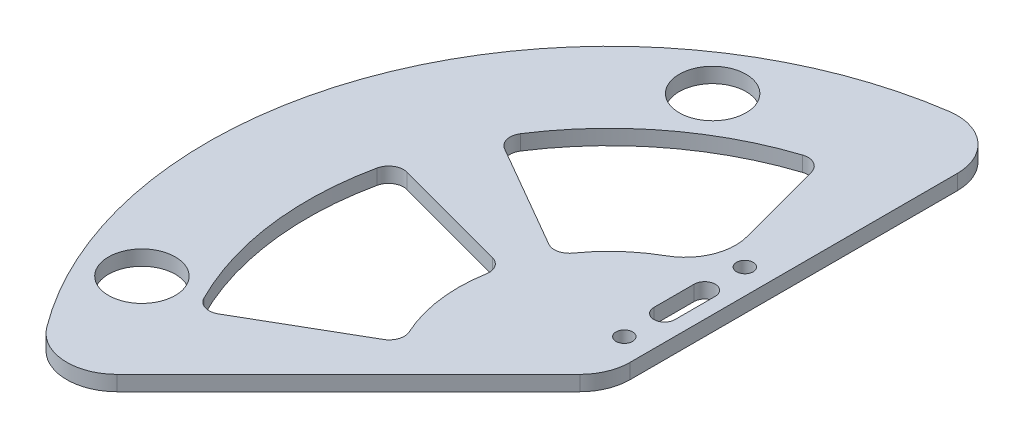
ISO-10303-21;
HEADER;
FILE_DESCRIPTION(('STEP AP214'),'2;1');
FILE_NAME('part.step','',(''),(''),'','','');
FILE_SCHEMA(('AUTOMOTIVE_DESIGN { 1 0 10303 214 1 1 1 1 }'));
ENDSEC;
DATA;
#1=APPLICATION_CONTEXT('core data for automotive mechanical design processes');
#2=APPLICATION_PROTOCOL_DEFINITION('international standard','automotive_design',2000,#1);
#3=PRODUCT_CONTEXT('',#1,'mechanical');
#4=PRODUCT('Part','Part','',(#3));
#5=PRODUCT_RELATED_PRODUCT_CATEGORY('part','',(#4));
#6=PRODUCT_DEFINITION_FORMATION('','',#4);
#7=PRODUCT_DEFINITION_CONTEXT('part definition',#1,'design');
#8=PRODUCT_DEFINITION('design','',#6,#7);
#9=PRODUCT_DEFINITION_SHAPE('','',#8);
#10=(LENGTH_UNIT() NAMED_UNIT(*) SI_UNIT(.MILLI.,.METRE.));
#11=(NAMED_UNIT(*) PLANE_ANGLE_UNIT() SI_UNIT($,.RADIAN.));
#12=(NAMED_UNIT(*) SI_UNIT($,.STERADIAN.) SOLID_ANGLE_UNIT());
#13=UNCERTAINTY_MEASURE_WITH_UNIT(LENGTH_MEASURE(1.E-05),#10,'distance_accuracy_value','');
#14=(GEOMETRIC_REPRESENTATION_CONTEXT(3) GLOBAL_UNCERTAINTY_ASSIGNED_CONTEXT((#13)) GLOBAL_UNIT_ASSIGNED_CONTEXT((#10,
#11,#12)) REPRESENTATION_CONTEXT('',''));
#15=CARTESIAN_POINT('',(0.,0.,0.));
#16=DIRECTION('',(0.,0.,1.));
#17=DIRECTION('',(1.,0.,0.));
#18=AXIS2_PLACEMENT_3D('',#15,#16,#17);
#19=CARTESIAN_POINT('',(0.,3.,0.));
#20=DIRECTION('',(0.,1.,0.));
#21=DIRECTION('',(0.,0.,1.));
#22=AXIS2_PLACEMENT_3D('',#19,#20,#21);
#23=PLANE('',#22);
#24=DIRECTION('',(0.,0.,1.));
#25=VECTOR('',#24,1.);
#26=CARTESIAN_POINT('',(-2.9,3.,-24.));
#27=LINE('',#26,#25);
#28=CARTESIAN_POINT('',(-2.90000000000001,3.,-16.));
#29=VERTEX_POINT('',#28);
#30=CARTESIAN_POINT('',(-2.90000000000001,3.,-24.));
#31=VERTEX_POINT('',#30);
#32=EDGE_CURVE('E241',#29,#31,#27,.F.);
#33=ORIENTED_EDGE('',*,*,#32,.F.);
#34=CARTESIAN_POINT('',(-5.00000000000001,3.,-16.));
#35=DIRECTION('',(0.,-1.,0.));
#36=DIRECTION('',(0.,0.,-1.));
#37=AXIS2_PLACEMENT_3D('',#34,#35,#36);
#38=CIRCLE('',#37,2.1);
#39=CARTESIAN_POINT('',(-7.1,3.,-16.));
#40=VERTEX_POINT('',#39);
#41=EDGE_CURVE('E240',#29,#40,#38,.T.);
#42=ORIENTED_EDGE('',*,*,#41,.T.);
#43=DIRECTION('',(0.,0.,-1.));
#44=VECTOR('',#43,1.);
#45=CARTESIAN_POINT('',(-7.10000000000001,3.,-24.));
#46=LINE('',#45,#44);
#47=CARTESIAN_POINT('',(-7.10000000000001,3.,-24.));
#48=VERTEX_POINT('',#47);
#49=EDGE_CURVE('E236',#48,#40,#46,.F.);
#50=ORIENTED_EDGE('',*,*,#49,.F.);
#51=CARTESIAN_POINT('',(-5.00000000000001,3.,-24.));
#52=DIRECTION('',(0.,-1.,0.));
#53=DIRECTION('',(0.,0.,-1.));
#54=AXIS2_PLACEMENT_3D('',#51,#52,#53);
#55=CIRCLE('',#54,2.1);
#56=EDGE_CURVE('E232',#48,#31,#55,.T.);
#57=ORIENTED_EDGE('',*,*,#56,.T.);
#58=EDGE_LOOP('',(#33,#42,#50,#57));
#59=FACE_BOUND('',#58,.T.);
#60=CARTESIAN_POINT('',(-63.4415450925655,3.,29.5832783218489));
#61=DIRECTION('',(0.,-1.,0.));
#62=DIRECTION('',(0.,0.,-1.));
#63=AXIS2_PLACEMENT_3D('',#60,#61,#62);
#64=CIRCLE('',#63,6.65000000000001);
#65=CARTESIAN_POINT('',(-63.4415450925655,3.,22.9332783218489));
#66=VERTEX_POINT('',#65);
#67=EDGE_CURVE('E269',#66,#66,#64,.T.);
#68=ORIENTED_EDGE('',*,*,#67,.T.);
#69=EDGE_LOOP('',(#68));
#70=FACE_BOUND('',#69,.T.);
#71=CARTESIAN_POINT('',(-5.00000000000001,3.,-8.));
#72=DIRECTION('',(0.,-1.,0.));
#73=DIRECTION('',(0.,0.,-1.));
#74=AXIS2_PLACEMENT_3D('',#71,#72,#73);
#75=CIRCLE('',#74,1.65);
#76=CARTESIAN_POINT('',(-5.00000000000001,3.,-9.65));
#77=VERTEX_POINT('',#76);
#78=EDGE_CURVE('E392',#77,#77,#75,.T.);
#79=ORIENTED_EDGE('',*,*,#78,.T.);
#80=EDGE_LOOP('',(#79));
#81=FACE_BOUND('',#80,.T.);
#82=CARTESIAN_POINT('',(0.,3.,0.));
#83=DIRECTION('',(0.,-1.,0.));
#84=DIRECTION('',(0.,0.,-1.));
#85=AXIS2_PLACEMENT_3D('',#82,#83,#84);
#86=CIRCLE('',#85,80.);
#87=CARTESIAN_POINT('',(-64.0695573343189,3.,47.9071166214836));
#88=VERTEX_POINT('',#87);
#89=CARTESIAN_POINT('',(-11.4285714285715,3.,-79.179465488863));
#90=VERTEX_POINT('',#89);
#91=EDGE_CURVE('E262',#88,#90,#86,.T.);
#92=ORIENTED_EDGE('',*,*,#91,.F.);
#93=CARTESIAN_POINT('',(-56.060862667529,3.,41.9187270437981));
#94=DIRECTION('',(0.,-1.,0.));
#95=DIRECTION('',(0.,0.,-1.));
#96=AXIS2_PLACEMENT_3D('',#93,#94,#95);
#97=CIRCLE('',#96,10.);
#98=CARTESIAN_POINT('',(-48.9897948556635,3.,48.9897948556636));
#99=VERTEX_POINT('',#98);
#100=EDGE_CURVE('E258',#99,#88,#97,.T.);
#101=ORIENTED_EDGE('',*,*,#100,.F.);
#102=DIRECTION('',(-0.707106781186547,0.,0.707106781186548));
#103=VECTOR('',#102,1.);
#104=CARTESIAN_POINT('',(0.,3.,0.));
#105=LINE('',#104,#103);
#106=CARTESIAN_POINT('',(-2.92893218813452,3.,2.92893218813451));
#107=VERTEX_POINT('',#106);
#108=EDGE_CURVE('E255',#99,#107,#105,.F.);
#109=ORIENTED_EDGE('',*,*,#108,.T.);
#110=CARTESIAN_POINT('',(-10.,3.,-4.14213562373096));
#111=DIRECTION('',(0.,-1.,0.));
#112=DIRECTION('',(0.,0.,-1.));
#113=AXIS2_PLACEMENT_3D('',#110,#111,#112);
#114=CIRCLE('',#113,10.);
#115=CARTESIAN_POINT('',(0.,3.,-4.14213562373096));
#116=VERTEX_POINT('',#115);
#117=EDGE_CURVE('E251',#116,#107,#114,.T.);
#118=ORIENTED_EDGE('',*,*,#117,.F.);
#119=DIRECTION('',(0.,0.,1.));
#120=VECTOR('',#119,1.);
#121=CARTESIAN_POINT('',(0.,3.,-80.));
#122=LINE('',#121,#120);
#123=CARTESIAN_POINT('',(0.,3.,-69.2820323027551));
#124=VERTEX_POINT('',#123);
#125=EDGE_CURVE('E245',#116,#124,#122,.F.);
#126=ORIENTED_EDGE('',*,*,#125,.T.);
#127=CARTESIAN_POINT('',(-10.,3.,-69.2820323027551));
#128=DIRECTION('',(0.,-1.,0.));
#129=DIRECTION('',(0.,0.,-1.));
#130=AXIS2_PLACEMENT_3D('',#127,#128,#129);
#131=CIRCLE('',#130,9.99999999999999);
#132=EDGE_CURVE('E387',#90,#124,#131,.T.);
#133=ORIENTED_EDGE('',*,*,#132,.F.);
#134=EDGE_LOOP('',(#92,#101,#109,#118,#126,#133));
#135=FACE_BOUND('',#134,.T.);
#136=CARTESIAN_POINT('',(-5.00000000000001,3.,-32.));
#137=DIRECTION('',(0.,-1.,0.));
#138=DIRECTION('',(0.,0.,-1.));
#139=AXIS2_PLACEMENT_3D('',#136,#137,#138);
#140=CIRCLE('',#139,1.65);
#141=CARTESIAN_POINT('',(-5.00000000000001,3.,-33.65));
#142=VERTEX_POINT('',#141);
#143=EDGE_CURVE('E389',#142,#142,#140,.T.);
#144=ORIENTED_EDGE('',*,*,#143,.T.);
#145=EDGE_LOOP('',(#144));
#146=FACE_BOUND('',#145,.T.);
#147=CARTESIAN_POINT('',(-38.1247324510516,3.,-58.7069397561799));
#148=DIRECTION('',(0.,-1.,0.));
#149=DIRECTION('',(0.,0.,-1.));
#150=AXIS2_PLACEMENT_3D('',#147,#148,#149);
#151=CIRCLE('',#150,6.65000000000001);
#152=CARTESIAN_POINT('',(-38.1247324510516,3.,-65.3569397561799));
#153=VERTEX_POINT('',#152);
#154=EDGE_CURVE('E395',#153,#153,#151,.T.);
#155=ORIENTED_EDGE('',*,*,#154,.T.);
#156=EDGE_LOOP('',(#155));
#157=FACE_BOUND('',#156,.T.);
#158=DIRECTION('',(0.866025403784442,0.,-0.499999999999995));
#159=VECTOR('',#158,1.);
#160=CARTESIAN_POINT('',(-51.9615242270665,3.,29.9999999999997));
#161=LINE('',#160,#159);
#162=CARTESIAN_POINT('',(-28.4604989415155,3.,16.4316767251548));
#163=VERTEX_POINT('',#162);
#164=CARTESIAN_POINT('',(-49.2950301754651,3.,28.4604989415151));
#165=VERTEX_POINT('',#164);
#166=EDGE_CURVE('E285',#163,#165,#161,.F.);
#167=ORIENTED_EDGE('',*,*,#166,.T.);
#168=CARTESIAN_POINT('',(-50.7950301754651,3.,25.8624227301618));
#169=DIRECTION('',(0.,1.,0.));
#170=DIRECTION('',(0.,0.,1.));
#171=AXIS2_PLACEMENT_3D('',#168,#169,#170);
#172=CIRCLE('',#171,3.);
#173=CARTESIAN_POINT('',(-53.4684528162791,3.,27.2236028738545));
#174=VERTEX_POINT('',#173);
#175=EDGE_CURVE('E202',#165,#174,#172,.F.);
#176=ORIENTED_EDGE('',*,*,#175,.T.);
#177=CARTESIAN_POINT('',(0.,3.,0.));
#178=DIRECTION('',(0.,1.,0.));
#179=DIRECTION('',(0.,0.,1.));
#180=AXIS2_PLACEMENT_3D('',#177,#178,#179);
#181=CIRCLE('',#180,60.);
#182=CARTESIAN_POINT('',(-58.6925463670236,3.,-12.4573271994752));
#183=VERTEX_POINT('',#182);
#184=EDGE_CURVE('E282',#174,#183,#181,.F.);
#185=ORIENTED_EDGE('',*,*,#184,.T.);
#186=CARTESIAN_POINT('',(-55.7579190486724,3.,-11.8344608395015));
#187=DIRECTION('',(0.,1.,0.));
#188=DIRECTION('',(0.,0.,1.));
#189=AXIS2_PLACEMENT_3D('',#186,#187,#188);
#190=CIRCLE('',#189,3.);
#191=CARTESIAN_POINT('',(-54.9814619133649,3.,-14.7322383183687));
#192=VERTEX_POINT('',#191);
#193=EDGE_CURVE('E278',#183,#192,#190,.F.);
#194=ORIENTED_EDGE('',*,*,#193,.T.);
#195=DIRECTION('',(-0.965925826289068,0.,-0.258819045102521));
#196=VECTOR('',#195,1.);
#197=CARTESIAN_POINT('',(-28.9777747886721,3.,-7.76457135307564));
#198=LINE('',#197,#196);
#199=CARTESIAN_POINT('',(-31.7435618361204,3.,-8.50566175887588));
#200=VERTEX_POINT('',#199);
#201=EDGE_CURVE('E274',#192,#200,#198,.F.);
#202=ORIENTED_EDGE('',*,*,#201,.T.);
#203=CARTESIAN_POINT('',(-32.5200189714279,3.,-5.60788428000867));
#204=DIRECTION('',(0.,1.,0.));
#205=DIRECTION('',(0.,0.,1.));
#206=AXIS2_PLACEMENT_3D('',#203,#204,#205);
#207=CIRCLE('',#206,3.);
#208=CARTESIAN_POINT('',(-29.563653610389,3.,-5.0980766181897));
#209=VERTEX_POINT('',#208);
#210=EDGE_CURVE('E273',#200,#209,#207,.F.);
#211=ORIENTED_EDGE('',*,*,#210,.T.);
#212=CARTESIAN_POINT('',(0.,3.,0.));
#213=DIRECTION('',(0.,1.,0.));
#214=DIRECTION('',(0.,0.,1.));
#215=AXIS2_PLACEMENT_3D('',#212,#213,#214);
#216=CIRCLE('',#215,30.);
#217=CARTESIAN_POINT('',(-27.2368172195595,3.,12.5760004670923));
#218=VERTEX_POINT('',#217);
#219=EDGE_CURVE('E266',#218,#209,#216,.F.);
#220=ORIENTED_EDGE('',*,*,#219,.F.);
#221=CARTESIAN_POINT('',(-29.9604989415155,3.,13.8336005138015));
#222=DIRECTION('',(0.,1.,0.));
#223=DIRECTION('',(0.,0.,1.));
#224=AXIS2_PLACEMENT_3D('',#221,#222,#223);
#225=CIRCLE('',#224,3.);
#226=EDGE_CURVE('E207',#218,#163,#225,.F.);
#227=ORIENTED_EDGE('',*,*,#226,.T.);
#228=EDGE_LOOP('',(#167,#176,#185,#194,#202,#211,#220,#227));
#229=FACE_BOUND('',#228,.T.);
#230=DIRECTION('',(-0.258819045102515,0.,-0.96592582628907));
#231=VECTOR('',#230,1.);
#232=CARTESIAN_POINT('',(-15.5291427061509,3.,-57.9555495773442));
#233=LINE('',#232,#231);
#234=CARTESIAN_POINT('',(-14.7322383183683,3.,-54.981461913365));
#235=VERTEX_POINT('',#234);
#236=CARTESIAN_POINT('',(-10.0240185136334,3.,-37.4101463888921));
#237=VERTEX_POINT('',#236);
#238=EDGE_CURVE('E313',#235,#237,#233,.F.);
#239=ORIENTED_EDGE('',*,*,#238,.T.);
#240=CARTESIAN_POINT('',(-19.6832767765241,3.,-34.8219559378669));
#241=DIRECTION('',(0.,1.,0.));
#242=DIRECTION('',(0.,0.,1.));
#243=AXIS2_PLACEMENT_3D('',#240,#241,#242);
#244=CIRCLE('',#243,10.);
#245=CARTESIAN_POINT('',(-14.7624575823931,3.,-26.1164669534002));
#246=VERTEX_POINT('',#245);
#247=EDGE_CURVE('E312',#237,#246,#244,.F.);
#248=ORIENTED_EDGE('',*,*,#247,.T.);
#249=CARTESIAN_POINT('',(0.,3.,0.));
#250=DIRECTION('',(0.,1.,0.));
#251=DIRECTION('',(0.,0.,1.));
#252=AXIS2_PLACEMENT_3D('',#249,#250,#251);
#253=CIRCLE('',#252,30.);
#254=CARTESIAN_POINT('',(-24.5095444922865,3.,-17.299775396826));
#255=VERTEX_POINT('',#254);
#256=EDGE_CURVE('E308',#255,#246,#253,.F.);
#257=ORIENTED_EDGE('',*,*,#256,.F.);
#258=CARTESIAN_POINT('',(-26.9604989415152,3.,-19.0297529365086));
#259=DIRECTION('',(0.,1.,0.));
#260=DIRECTION('',(0.,0.,1.));
#261=AXIS2_PLACEMENT_3D('',#258,#259,#260);
#262=CIRCLE('',#261,3.);
#263=CARTESIAN_POINT('',(-28.4604989415152,3.,-16.4316767251553));
#264=VERTEX_POINT('',#263);
#265=EDGE_CURVE('E302',#255,#264,#262,.F.);
#266=ORIENTED_EDGE('',*,*,#265,.T.);
#267=DIRECTION('',(0.866025403784433,0.,0.50000000000001));
#268=VECTOR('',#267,1.);
#269=CARTESIAN_POINT('',(-25.980762113533,3.,-15.0000000000003));
#270=LINE('',#269,#268);
#271=CARTESIAN_POINT('',(-49.2950301754646,3.,-28.460498941516));
#272=VERTEX_POINT('',#271);
#273=EDGE_CURVE('E298',#264,#272,#270,.F.);
#274=ORIENTED_EDGE('',*,*,#273,.T.);
#275=CARTESIAN_POINT('',(-47.7950301754646,3.,-31.0585751528693));
#276=DIRECTION('',(0.,1.,0.));
#277=DIRECTION('',(0.,0.,1.));
#278=AXIS2_PLACEMENT_3D('',#275,#276,#277);
#279=CIRCLE('',#278,3.);
#280=CARTESIAN_POINT('',(-50.3105580794364,3.,-32.6932370030203));
#281=VERTEX_POINT('',#280);
#282=EDGE_CURVE('E294',#272,#281,#279,.F.);
#283=ORIENTED_EDGE('',*,*,#282,.T.);
#284=CARTESIAN_POINT('',(0.,3.,0.));
#285=DIRECTION('',(0.,1.,0.));
#286=DIRECTION('',(0.,0.,1.));
#287=AXIS2_PLACEMENT_3D('',#284,#285,#286);
#288=CIRCLE('',#287,60.);
#289=CARTESIAN_POINT('',(-18.557911365511,3.,-57.0578997663762));
#290=VERTEX_POINT('',#289);
#291=EDGE_CURVE('E290',#281,#290,#288,.F.);
#292=ORIENTED_EDGE('',*,*,#291,.T.);
#293=CARTESIAN_POINT('',(-17.6300157972355,3.,-54.2050047780574));
#294=DIRECTION('',(0.,1.,0.));
#295=DIRECTION('',(0.,0.,1.));
#296=AXIS2_PLACEMENT_3D('',#293,#294,#295);
#297=CIRCLE('',#296,3.);
#298=EDGE_CURVE('E19',#290,#235,#297,.F.);
#299=ORIENTED_EDGE('',*,*,#298,.T.);
#300=EDGE_LOOP('',(#239,#248,#257,#266,#274,#283,#292,#299));
#301=FACE_BOUND('',#300,.T.);
#302=ADVANCED_FACE('F16',(#59,#70,#81,#135,#146,#157,#229,#301),#23,.T.);
#303=CARTESIAN_POINT('',(-17.6300157972355,0.,-54.2050047780574));
#304=DIRECTION('',(0.,1.,0.));
#305=DIRECTION('',(0.,0.,1.));
#306=AXIS2_PLACEMENT_3D('',#303,#304,#305);
#307=CYLINDRICAL_SURFACE('',#306,3.);
#308=DIRECTION('',(0.,1.,0.));
#309=VECTOR('',#308,1.);
#310=CARTESIAN_POINT('',(-14.7322383183683,0.,-54.981461913365));
#311=LINE('',#310,#309);
#312=CARTESIAN_POINT('',(-14.7322383183683,0.,-54.981461913365));
#313=VERTEX_POINT('',#312);
#314=EDGE_CURVE('E314',#313,#235,#311,.T.);
#315=ORIENTED_EDGE('',*,*,#314,.T.);
#316=ORIENTED_EDGE('',*,*,#298,.F.);
#317=DIRECTION('',(0.,1.,0.));
#318=VECTOR('',#317,1.);
#319=CARTESIAN_POINT('',(-18.557911365511,0.,-57.0578997663762));
#320=LINE('',#319,#318);
#321=CARTESIAN_POINT('',(-18.557911365511,0.,-57.0578997663762));
#322=VERTEX_POINT('',#321);
#323=EDGE_CURVE('E287',#290,#322,#320,.F.);
#324=ORIENTED_EDGE('',*,*,#323,.T.);
#325=CARTESIAN_POINT('',(-17.6300157972355,0.,-54.2050047780574));
#326=DIRECTION('',(0.,1.,0.));
#327=DIRECTION('',(0.,0.,1.));
#328=AXIS2_PLACEMENT_3D('',#325,#326,#327);
#329=CIRCLE('',#328,3.);
#330=EDGE_CURVE('E228',#322,#313,#329,.F.);
#331=ORIENTED_EDGE('',*,*,#330,.T.);
#332=EDGE_LOOP('',(#315,#316,#324,#331));
#333=FACE_BOUND('',#332,.T.);
#334=ADVANCED_FACE('F442',(#333),#307,.F.);
#335=CARTESIAN_POINT('',(-15.5291427061509,0.,-57.9555495773442));
#336=DIRECTION('',(0.96592582628907,0.,-0.258819045102515));
#337=DIRECTION('',(-0.258819045102515,0.,-0.96592582628907));
#338=AXIS2_PLACEMENT_3D('',#335,#336,#337);
#339=PLANE('',#338);
#340=ORIENTED_EDGE('',*,*,#314,.F.);
#341=DIRECTION('',(0.258819045102515,0.,0.96592582628907));
#342=VECTOR('',#341,1.);
#343=CARTESIAN_POINT('',(-14.7322383183683,0.,-54.981461913365));
#344=LINE('',#343,#342);
#345=CARTESIAN_POINT('',(-10.0240185136334,0.,-37.4101463888921));
#346=VERTEX_POINT('',#345);
#347=EDGE_CURVE('E224',#313,#346,#344,.T.);
#348=ORIENTED_EDGE('',*,*,#347,.T.);
#349=DIRECTION('',(0.,1.,0.));
#350=VECTOR('',#349,1.);
#351=CARTESIAN_POINT('',(-10.0240185136334,0.,-37.4101463888921));
#352=LINE('',#351,#350);
#353=EDGE_CURVE('E309',#346,#237,#352,.T.);
#354=ORIENTED_EDGE('',*,*,#353,.T.);
#355=ORIENTED_EDGE('',*,*,#238,.F.);
#356=EDGE_LOOP('',(#340,#348,#354,#355));
#357=FACE_BOUND('',#356,.T.);
#358=ADVANCED_FACE('F444',(#357),#339,.F.);
#359=CARTESIAN_POINT('',(-19.6832767765241,0.,-34.8219559378669));
#360=DIRECTION('',(0.,1.,0.));
#361=DIRECTION('',(0.,0.,1.));
#362=AXIS2_PLACEMENT_3D('',#359,#360,#361);
#363=CYLINDRICAL_SURFACE('',#362,10.);
#364=DIRECTION('',(0.,1.,0.));
#365=VECTOR('',#364,1.);
#366=CARTESIAN_POINT('',(-14.7624575823931,0.,-26.1164669534002));
#367=LINE('',#366,#365);
#368=CARTESIAN_POINT('',(-14.7624575823931,0.,-26.1164669534002));
#369=VERTEX_POINT('',#368);
#370=EDGE_CURVE('E306',#246,#369,#367,.F.);
#371=ORIENTED_EDGE('',*,*,#370,.F.);
#372=ORIENTED_EDGE('',*,*,#247,.F.);
#373=ORIENTED_EDGE('',*,*,#353,.F.);
#374=CARTESIAN_POINT('',(-19.6832767765241,0.,-34.8219559378669));
#375=DIRECTION('',(0.,1.,0.));
#376=DIRECTION('',(0.,0.,1.));
#377=AXIS2_PLACEMENT_3D('',#374,#375,#376);
#378=CIRCLE('',#377,10.);
#379=EDGE_CURVE('E227',#346,#369,#378,.F.);
#380=ORIENTED_EDGE('',*,*,#379,.T.);
#381=EDGE_LOOP('',(#371,#372,#373,#380));
#382=FACE_BOUND('',#381,.T.);
#383=ADVANCED_FACE('F418',(#382),#363,.F.);
#384=CARTESIAN_POINT('',(0.,0.,0.));
#385=DIRECTION('',(0.,1.,0.));
#386=DIRECTION('',(0.,0.,1.));
#387=AXIS2_PLACEMENT_3D('',#384,#385,#386);
#388=CYLINDRICAL_SURFACE('',#387,30.);
#389=ORIENTED_EDGE('',*,*,#256,.T.);
#390=ORIENTED_EDGE('',*,*,#370,.T.);
#391=CARTESIAN_POINT('',(0.,0.,0.));
#392=DIRECTION('',(0.,1.,0.));
#393=DIRECTION('',(0.,0.,1.));
#394=AXIS2_PLACEMENT_3D('',#391,#392,#393);
#395=CIRCLE('',#394,30.);
#396=CARTESIAN_POINT('',(-24.5095444922865,0.,-17.299775396826));
#397=VERTEX_POINT('',#396);
#398=EDGE_CURVE('E372',#369,#397,#395,.T.);
#399=ORIENTED_EDGE('',*,*,#398,.T.);
#400=DIRECTION('',(0.,1.,0.));
#401=VECTOR('',#400,1.);
#402=CARTESIAN_POINT('',(-24.5095444922865,0.,-17.299775396826));
#403=LINE('',#402,#401);
#404=EDGE_CURVE('E303',#397,#255,#403,.T.);
#405=ORIENTED_EDGE('',*,*,#404,.T.);
#406=EDGE_LOOP('',(#389,#390,#399,#405));
#407=FACE_BOUND('',#406,.T.);
#408=ADVANCED_FACE('F422',(#407),#388,.T.);
#409=CARTESIAN_POINT('',(-26.9604989415152,0.,-19.0297529365086));
#410=DIRECTION('',(0.,1.,0.));
#411=DIRECTION('',(0.,0.,1.));
#412=AXIS2_PLACEMENT_3D('',#409,#410,#411);
#413=CYLINDRICAL_SURFACE('',#412,3.);
#414=CARTESIAN_POINT('',(-26.9604989415152,0.,-19.0297529365086));
#415=DIRECTION('',(0.,1.,0.));
#416=DIRECTION('',(0.,0.,1.));
#417=AXIS2_PLACEMENT_3D('',#414,#415,#416);
#418=CIRCLE('',#417,3.);
#419=CARTESIAN_POINT('',(-28.4604989415152,0.,-16.4316767251553));
#420=VERTEX_POINT('',#419);
#421=EDGE_CURVE('E223',#397,#420,#418,.F.);
#422=ORIENTED_EDGE('',*,*,#421,.T.);
#423=DIRECTION('',(0.,1.,0.));
#424=VECTOR('',#423,1.);
#425=CARTESIAN_POINT('',(-28.4604989415152,0.,-16.4316767251553));
#426=LINE('',#425,#424);
#427=EDGE_CURVE('E299',#420,#264,#426,.T.);
#428=ORIENTED_EDGE('',*,*,#427,.T.);
#429=ORIENTED_EDGE('',*,*,#265,.F.);
#430=ORIENTED_EDGE('',*,*,#404,.F.);
#431=EDGE_LOOP('',(#422,#428,#429,#430));
#432=FACE_BOUND('',#431,.T.);
#433=ADVANCED_FACE('F429',(#432),#413,.F.);
#434=CARTESIAN_POINT('',(-25.980762113533,0.,-15.0000000000003));
#435=DIRECTION('',(-0.50000000000001,0.,0.866025403784433));
#436=DIRECTION('',(0.866025403784433,0.,0.50000000000001));
#437=AXIS2_PLACEMENT_3D('',#434,#435,#436);
#438=PLANE('',#437);
#439=ORIENTED_EDGE('',*,*,#427,.F.);
#440=DIRECTION('',(-0.866025403784433,0.,-0.50000000000001));
#441=VECTOR('',#440,1.);
#442=CARTESIAN_POINT('',(-28.4604989415152,0.,-16.4316767251553));
#443=LINE('',#442,#441);
#444=CARTESIAN_POINT('',(-49.2950301754646,0.,-28.460498941516));
#445=VERTEX_POINT('',#444);
#446=EDGE_CURVE('E219',#420,#445,#443,.T.);
#447=ORIENTED_EDGE('',*,*,#446,.T.);
#448=DIRECTION('',(0.,1.,0.));
#449=VECTOR('',#448,1.);
#450=CARTESIAN_POINT('',(-49.2950301754646,0.,-28.460498941516));
#451=LINE('',#450,#449);
#452=EDGE_CURVE('E295',#445,#272,#451,.T.);
#453=ORIENTED_EDGE('',*,*,#452,.T.);
#454=ORIENTED_EDGE('',*,*,#273,.F.);
#455=EDGE_LOOP('',(#439,#447,#453,#454));
#456=FACE_BOUND('',#455,.T.);
#457=ADVANCED_FACE('F432',(#456),#438,.F.);
#458=CARTESIAN_POINT('',(-47.7950301754646,0.,-31.0585751528693));
#459=DIRECTION('',(0.,1.,0.));
#460=DIRECTION('',(0.,0.,1.));
#461=AXIS2_PLACEMENT_3D('',#458,#459,#460);
#462=CYLINDRICAL_SURFACE('',#461,3.);
#463=DIRECTION('',(0.,1.,0.));
#464=VECTOR('',#463,1.);
#465=CARTESIAN_POINT('',(-50.3105580794364,0.,-32.6932370030204));
#466=LINE('',#465,#464);
#467=CARTESIAN_POINT('',(-50.3105580794364,0.,-32.6932370030203));
#468=VERTEX_POINT('',#467);
#469=EDGE_CURVE('E291',#468,#281,#466,.T.);
#470=ORIENTED_EDGE('',*,*,#469,.T.);
#471=ORIENTED_EDGE('',*,*,#282,.F.);
#472=ORIENTED_EDGE('',*,*,#452,.F.);
#473=CARTESIAN_POINT('',(-47.7950301754646,0.,-31.0585751528693));
#474=DIRECTION('',(0.,1.,0.));
#475=DIRECTION('',(0.,0.,1.));
#476=AXIS2_PLACEMENT_3D('',#473,#474,#475);
#477=CIRCLE('',#476,3.);
#478=EDGE_CURVE('E222',#445,#468,#477,.F.);
#479=ORIENTED_EDGE('',*,*,#478,.T.);
#480=EDGE_LOOP('',(#470,#471,#472,#479));
#481=FACE_BOUND('',#480,.T.);
#482=ADVANCED_FACE('F436',(#481),#462,.F.);
#483=CARTESIAN_POINT('',(0.,0.,0.));
#484=DIRECTION('',(0.,1.,0.));
#485=DIRECTION('',(0.,0.,1.));
#486=AXIS2_PLACEMENT_3D('',#483,#484,#485);
#487=CYLINDRICAL_SURFACE('',#486,60.);
#488=ORIENTED_EDGE('',*,*,#323,.F.);
#489=ORIENTED_EDGE('',*,*,#291,.F.);
#490=ORIENTED_EDGE('',*,*,#469,.F.);
#491=CARTESIAN_POINT('',(0.,0.,0.));
#492=DIRECTION('',(0.,1.,0.));
#493=DIRECTION('',(0.,0.,1.));
#494=AXIS2_PLACEMENT_3D('',#491,#492,#493);
#495=CIRCLE('',#494,60.);
#496=EDGE_CURVE('E213',#468,#322,#495,.F.);
#497=ORIENTED_EDGE('',*,*,#496,.T.);
#498=EDGE_LOOP('',(#488,#489,#490,#497));
#499=FACE_BOUND('',#498,.T.);
#500=ADVANCED_FACE('F440',(#499),#487,.F.);
#501=CARTESIAN_POINT('',(-29.9604989415155,0.,13.8336005138015));
#502=DIRECTION('',(0.,1.,0.));
#503=DIRECTION('',(0.,0.,1.));
#504=AXIS2_PLACEMENT_3D('',#501,#502,#503);
#505=CYLINDRICAL_SURFACE('',#504,3.);
#506=DIRECTION('',(0.,1.,0.));
#507=VECTOR('',#506,1.);
#508=CARTESIAN_POINT('',(-28.4604989415155,0.,16.4316767251548));
#509=LINE('',#508,#507);
#510=CARTESIAN_POINT('',(-28.4604989415155,0.,16.4316767251548));
#511=VERTEX_POINT('',#510);
#512=EDGE_CURVE('E206',#511,#163,#509,.T.);
#513=ORIENTED_EDGE('',*,*,#512,.T.);
#514=ORIENTED_EDGE('',*,*,#226,.F.);
#515=DIRECTION('',(0.,1.,0.));
#516=VECTOR('',#515,1.);
#517=CARTESIAN_POINT('',(-27.2368172195596,0.,12.5760004670922));
#518=LINE('',#517,#516);
#519=CARTESIAN_POINT('',(-27.2368172195595,0.,12.5760004670923));
#520=VERTEX_POINT('',#519);
#521=EDGE_CURVE('E265',#520,#218,#518,.T.);
#522=ORIENTED_EDGE('',*,*,#521,.F.);
#523=CARTESIAN_POINT('',(-29.9604989415155,0.,13.8336005138015));
#524=DIRECTION('',(0.,1.,0.));
#525=DIRECTION('',(0.,0.,1.));
#526=AXIS2_PLACEMENT_3D('',#523,#524,#525);
#527=CIRCLE('',#526,3.);
#528=EDGE_CURVE('E211',#520,#511,#527,.F.);
#529=ORIENTED_EDGE('',*,*,#528,.T.);
#530=EDGE_LOOP('',(#513,#514,#522,#529));
#531=FACE_BOUND('',#530,.T.);
#532=ADVANCED_FACE('F539',(#531),#505,.F.);
#533=CARTESIAN_POINT('',(-51.9615242270665,0.,29.9999999999997));
#534=DIRECTION('',(0.499999999999995,0.,0.866025403784442));
#535=DIRECTION('',(0.866025403784442,0.,-0.499999999999995));
#536=AXIS2_PLACEMENT_3D('',#533,#534,#535);
#537=PLANE('',#536);
#538=ORIENTED_EDGE('',*,*,#512,.F.);
#539=DIRECTION('',(-0.866025403784442,0.,0.499999999999995));
#540=VECTOR('',#539,1.);
#541=CARTESIAN_POINT('',(-28.4604989415155,0.,16.4316767251548));
#542=LINE('',#541,#540);
#543=CARTESIAN_POINT('',(-49.2950301754651,0.,28.4604989415151));
#544=VERTEX_POINT('',#543);
#545=EDGE_CURVE('E191',#511,#544,#542,.T.);
#546=ORIENTED_EDGE('',*,*,#545,.T.);
#547=DIRECTION('',(0.,1.,0.));
#548=VECTOR('',#547,1.);
#549=CARTESIAN_POINT('',(-49.2950301754651,0.,28.4604989415151));
#550=LINE('',#549,#548);
#551=EDGE_CURVE('E200',#165,#544,#550,.F.);
#552=ORIENTED_EDGE('',*,*,#551,.F.);
#553=ORIENTED_EDGE('',*,*,#166,.F.);
#554=EDGE_LOOP('',(#538,#546,#552,#553));
#555=FACE_BOUND('',#554,.T.);
#556=ADVANCED_FACE('F209',(#555),#537,.F.);
#557=CARTESIAN_POINT('',(-50.7950301754651,0.,25.8624227301618));
#558=DIRECTION('',(0.,1.,0.));
#559=DIRECTION('',(0.,0.,1.));
#560=AXIS2_PLACEMENT_3D('',#557,#558,#559);
#561=CYLINDRICAL_SURFACE('',#560,3.);
#562=CARTESIAN_POINT('',(-50.7950301754651,0.,25.8624227301618));
#563=DIRECTION('',(0.,1.,0.));
#564=DIRECTION('',(0.,0.,1.));
#565=AXIS2_PLACEMENT_3D('',#562,#563,#564);
#566=CIRCLE('',#565,3.);
#567=CARTESIAN_POINT('',(-53.4684528162791,0.,27.2236028738545));
#568=VERTEX_POINT('',#567);
#569=EDGE_CURVE('E185',#544,#568,#566,.F.);
#570=ORIENTED_EDGE('',*,*,#569,.T.);
#571=DIRECTION('',(0.,1.,0.));
#572=VECTOR('',#571,1.);
#573=CARTESIAN_POINT('',(-53.4684528162791,0.,27.2236028738545));
#574=LINE('',#573,#572);
#575=EDGE_CURVE('E283',#568,#174,#574,.T.);
#576=ORIENTED_EDGE('',*,*,#575,.T.);
#577=ORIENTED_EDGE('',*,*,#175,.F.);
#578=ORIENTED_EDGE('',*,*,#551,.T.);
#579=EDGE_LOOP('',(#570,#576,#577,#578));
#580=FACE_BOUND('',#579,.T.);
#581=ADVANCED_FACE('F201',(#580),#561,.F.);
#582=CARTESIAN_POINT('',(0.,0.,0.));
#583=DIRECTION('',(0.,1.,0.));
#584=DIRECTION('',(0.,0.,1.));
#585=AXIS2_PLACEMENT_3D('',#582,#583,#584);
#586=CYLINDRICAL_SURFACE('',#585,60.);
#587=DIRECTION('',(0.,1.,0.));
#588=VECTOR('',#587,1.);
#589=CARTESIAN_POINT('',(-58.6925463670236,0.,-12.4573271994752));
#590=LINE('',#589,#588);
#591=CARTESIAN_POINT('',(-58.6925463670236,0.,-12.4573271994752));
#592=VERTEX_POINT('',#591);
#593=EDGE_CURVE('E279',#592,#183,#590,.T.);
#594=ORIENTED_EDGE('',*,*,#593,.T.);
#595=ORIENTED_EDGE('',*,*,#184,.F.);
#596=ORIENTED_EDGE('',*,*,#575,.F.);
#597=CARTESIAN_POINT('',(0.,0.,0.));
#598=DIRECTION('',(0.,1.,0.));
#599=DIRECTION('',(0.,0.,1.));
#600=AXIS2_PLACEMENT_3D('',#597,#598,#599);
#601=CIRCLE('',#600,60.);
#602=EDGE_CURVE('E195',#568,#592,#601,.F.);
#603=ORIENTED_EDGE('',*,*,#602,.T.);
#604=EDGE_LOOP('',(#594,#595,#596,#603));
#605=FACE_BOUND('',#604,.T.);
#606=ADVANCED_FACE('F530',(#605),#586,.F.);
#607=CARTESIAN_POINT('',(-55.7579190486724,0.,-11.8344608395015));
#608=DIRECTION('',(0.,1.,0.));
#609=DIRECTION('',(0.,0.,1.));
#610=AXIS2_PLACEMENT_3D('',#607,#608,#609);
#611=CYLINDRICAL_SURFACE('',#610,3.);
#612=DIRECTION('',(0.,1.,0.));
#613=VECTOR('',#612,1.);
#614=CARTESIAN_POINT('',(-54.9814619133649,0.,-14.7322383183687));
#615=LINE('',#614,#613);
#616=CARTESIAN_POINT('',(-54.9814619133649,0.,-14.7322383183687));
#617=VERTEX_POINT('',#616);
#618=EDGE_CURVE('E275',#617,#192,#615,.T.);
#619=ORIENTED_EDGE('',*,*,#618,.T.);
#620=ORIENTED_EDGE('',*,*,#193,.F.);
#621=ORIENTED_EDGE('',*,*,#593,.F.);
#622=CARTESIAN_POINT('',(-55.7579190486724,0.,-11.8344608395015));
#623=DIRECTION('',(0.,1.,0.));
#624=DIRECTION('',(0.,0.,1.));
#625=AXIS2_PLACEMENT_3D('',#622,#623,#624);
#626=CIRCLE('',#625,3.);
#627=EDGE_CURVE('E362',#592,#617,#626,.F.);
#628=ORIENTED_EDGE('',*,*,#627,.T.);
#629=EDGE_LOOP('',(#619,#620,#621,#628));
#630=FACE_BOUND('',#629,.T.);
#631=ADVANCED_FACE('F526',(#630),#611,.F.);
#632=CARTESIAN_POINT('',(-28.9777747886721,0.,-7.76457135307564));
#633=DIRECTION('',(0.258819045102521,0.,-0.965925826289068));
#634=DIRECTION('',(-0.965925826289068,0.,-0.258819045102521));
#635=AXIS2_PLACEMENT_3D('',#632,#633,#634);
#636=PLANE('',#635);
#637=ORIENTED_EDGE('',*,*,#618,.F.);
#638=DIRECTION('',(0.965925826289068,0.,0.258819045102521));
#639=VECTOR('',#638,1.);
#640=CARTESIAN_POINT('',(-54.9814619133649,0.,-14.7322383183687));
#641=LINE('',#640,#639);
#642=CARTESIAN_POINT('',(-31.7435618361204,0.,-8.50566175887588));
#643=VERTEX_POINT('',#642);
#644=EDGE_CURVE('E217',#617,#643,#641,.T.);
#645=ORIENTED_EDGE('',*,*,#644,.T.);
#646=DIRECTION('',(0.,1.,0.));
#647=VECTOR('',#646,1.);
#648=CARTESIAN_POINT('',(-31.7435618361204,0.,-8.50566175887588));
#649=LINE('',#648,#647);
#650=EDGE_CURVE('E270',#643,#200,#649,.T.);
#651=ORIENTED_EDGE('',*,*,#650,.T.);
#652=ORIENTED_EDGE('',*,*,#201,.F.);
#653=EDGE_LOOP('',(#637,#645,#651,#652));
#654=FACE_BOUND('',#653,.T.);
#655=ADVANCED_FACE('F522',(#654),#636,.F.);
#656=CARTESIAN_POINT('',(-32.5200189714279,0.,-5.60788428000867));
#657=DIRECTION('',(0.,1.,0.));
#658=DIRECTION('',(0.,0.,1.));
#659=AXIS2_PLACEMENT_3D('',#656,#657,#658);
#660=CYLINDRICAL_SURFACE('',#659,3.);
#661=DIRECTION('',(0.,1.,0.));
#662=VECTOR('',#661,1.);
#663=CARTESIAN_POINT('',(-29.563653610389,0.,-5.0980766181897));
#664=LINE('',#663,#662);
#665=CARTESIAN_POINT('',(-29.563653610389,0.,-5.0980766181897));
#666=VERTEX_POINT('',#665);
#667=EDGE_CURVE('E263',#209,#666,#664,.F.);
#668=ORIENTED_EDGE('',*,*,#667,.F.);
#669=ORIENTED_EDGE('',*,*,#210,.F.);
#670=ORIENTED_EDGE('',*,*,#650,.F.);
#671=CARTESIAN_POINT('',(-32.5200189714279,0.,-5.60788428000867));
#672=DIRECTION('',(0.,1.,0.));
#673=DIRECTION('',(0.,0.,1.));
#674=AXIS2_PLACEMENT_3D('',#671,#672,#673);
#675=CIRCLE('',#674,3.);
#676=EDGE_CURVE('E359',#643,#666,#675,.F.);
#677=ORIENTED_EDGE('',*,*,#676,.T.);
#678=EDGE_LOOP('',(#668,#669,#670,#677));
#679=FACE_BOUND('',#678,.T.);
#680=ADVANCED_FACE('F518',(#679),#660,.F.);
#681=CARTESIAN_POINT('',(0.,0.,0.));
#682=DIRECTION('',(0.,1.,0.));
#683=DIRECTION('',(0.,0.,1.));
#684=AXIS2_PLACEMENT_3D('',#681,#682,#683);
#685=CYLINDRICAL_SURFACE('',#684,30.);
#686=CARTESIAN_POINT('',(0.,0.,0.));
#687=DIRECTION('',(0.,1.,0.));
#688=DIRECTION('',(0.,0.,1.));
#689=AXIS2_PLACEMENT_3D('',#686,#687,#688);
#690=CIRCLE('',#689,30.);
#691=EDGE_CURVE('E356',#666,#520,#690,.T.);
#692=ORIENTED_EDGE('',*,*,#691,.T.);
#693=ORIENTED_EDGE('',*,*,#521,.T.);
#694=ORIENTED_EDGE('',*,*,#219,.T.);
#695=ORIENTED_EDGE('',*,*,#667,.T.);
#696=EDGE_LOOP('',(#692,#693,#694,#695));
#697=FACE_BOUND('',#696,.T.);
#698=ADVANCED_FACE('F514',(#697),#685,.T.);
#699=CARTESIAN_POINT('',(-63.4415450925655,3.,29.5832783218489));
#700=DIRECTION('',(0.,-1.,0.));
#701=DIRECTION('',(0.,0.,-1.));
#702=AXIS2_PLACEMENT_3D('',#699,#700,#701);
#703=CYLINDRICAL_SURFACE('',#702,6.65000000000001);
#704=CARTESIAN_POINT('',(-63.4415450925655,0.,29.5832783218489));
#705=DIRECTION('',(0.,-1.,0.));
#706=DIRECTION('',(0.,0.,-1.));
#707=AXIS2_PLACEMENT_3D('',#704,#705,#706);
#708=CIRCLE('',#707,6.65000000000001);
#709=CARTESIAN_POINT('',(-63.4415450925655,0.,22.9332783218489));
#710=VERTEX_POINT('',#709);
#711=EDGE_CURVE('E353',#710,#710,#708,.T.);
#712=ORIENTED_EDGE('',*,*,#711,.T.);
#713=EDGE_LOOP('',(#712));
#714=FACE_BOUND('',#713,.T.);
#715=ORIENTED_EDGE('',*,*,#67,.F.);
#716=EDGE_LOOP('',(#715));
#717=FACE_BOUND('',#716,.T.);
#718=ADVANCED_FACE('F510',(#714,#717),#703,.F.);
#719=CARTESIAN_POINT('',(-38.1247324510516,3.,-58.7069397561799));
#720=DIRECTION('',(0.,-1.,0.));
#721=DIRECTION('',(0.,0.,-1.));
#722=AXIS2_PLACEMENT_3D('',#719,#720,#721);
#723=CYLINDRICAL_SURFACE('',#722,6.65000000000001);
#724=CARTESIAN_POINT('',(-38.1247324510516,0.,-58.7069397561799));
#725=DIRECTION('',(0.,-1.,0.));
#726=DIRECTION('',(0.,0.,-1.));
#727=AXIS2_PLACEMENT_3D('',#724,#725,#726);
#728=CIRCLE('',#727,6.65000000000001);
#729=CARTESIAN_POINT('',(-38.1247324510516,0.,-65.3569397561799));
#730=VERTEX_POINT('',#729);
#731=EDGE_CURVE('E350',#730,#730,#728,.T.);
#732=ORIENTED_EDGE('',*,*,#731,.T.);
#733=EDGE_LOOP('',(#732));
#734=FACE_BOUND('',#733,.T.);
#735=ORIENTED_EDGE('',*,*,#154,.F.);
#736=EDGE_LOOP('',(#735));
#737=FACE_BOUND('',#736,.T.);
#738=ADVANCED_FACE('F506',(#734,#737),#723,.F.);
#739=CARTESIAN_POINT('',(-5.00000000000001,3.,-8.));
#740=DIRECTION('',(0.,-1.,0.));
#741=DIRECTION('',(0.,0.,-1.));
#742=AXIS2_PLACEMENT_3D('',#739,#740,#741);
#743=CYLINDRICAL_SURFACE('',#742,1.65);
#744=CARTESIAN_POINT('',(-5.00000000000001,0.,-8.));
#745=DIRECTION('',(0.,-1.,0.));
#746=DIRECTION('',(0.,0.,-1.));
#747=AXIS2_PLACEMENT_3D('',#744,#745,#746);
#748=CIRCLE('',#747,1.65);
#749=CARTESIAN_POINT('',(-5.00000000000001,0.,-9.65));
#750=VERTEX_POINT('',#749);
#751=EDGE_CURVE('E347',#750,#750,#748,.T.);
#752=ORIENTED_EDGE('',*,*,#751,.T.);
#753=EDGE_LOOP('',(#752));
#754=FACE_BOUND('',#753,.T.);
#755=ORIENTED_EDGE('',*,*,#78,.F.);
#756=EDGE_LOOP('',(#755));
#757=FACE_BOUND('',#756,.T.);
#758=ADVANCED_FACE('F502',(#754,#757),#743,.F.);
#759=CARTESIAN_POINT('',(-5.00000000000001,3.,-32.));
#760=DIRECTION('',(0.,-1.,0.));
#761=DIRECTION('',(0.,0.,-1.));
#762=AXIS2_PLACEMENT_3D('',#759,#760,#761);
#763=CYLINDRICAL_SURFACE('',#762,1.65);
#764=CARTESIAN_POINT('',(-5.00000000000001,0.,-32.));
#765=DIRECTION('',(0.,-1.,0.));
#766=DIRECTION('',(0.,0.,-1.));
#767=AXIS2_PLACEMENT_3D('',#764,#765,#766);
#768=CIRCLE('',#767,1.65);
#769=CARTESIAN_POINT('',(-5.00000000000001,0.,-33.65));
#770=VERTEX_POINT('',#769);
#771=EDGE_CURVE('E344',#770,#770,#768,.T.);
#772=ORIENTED_EDGE('',*,*,#771,.T.);
#773=EDGE_LOOP('',(#772));
#774=FACE_BOUND('',#773,.T.);
#775=ORIENTED_EDGE('',*,*,#143,.F.);
#776=EDGE_LOOP('',(#775));
#777=FACE_BOUND('',#776,.T.);
#778=ADVANCED_FACE('F498',(#774,#777),#763,.F.);
#779=CARTESIAN_POINT('',(-10.,3.,-69.2820323027551));
#780=DIRECTION('',(0.,-1.,0.));
#781=DIRECTION('',(0.,0.,-1.));
#782=AXIS2_PLACEMENT_3D('',#779,#780,#781);
#783=CYLINDRICAL_SURFACE('',#782,9.99999999999999);
#784=DIRECTION('',(0.,1.,0.));
#785=VECTOR('',#784,1.);
#786=CARTESIAN_POINT('',(0.,3.,-69.2820323027551));
#787=LINE('',#786,#785);
#788=CARTESIAN_POINT('',(0.,0.,-69.2820323027551));
#789=VERTEX_POINT('',#788);
#790=EDGE_CURVE('E246',#124,#789,#787,.F.);
#791=ORIENTED_EDGE('',*,*,#790,.T.);
#792=CARTESIAN_POINT('',(-10.,0.,-69.2820323027551));
#793=DIRECTION('',(0.,-1.,0.));
#794=DIRECTION('',(0.,0.,-1.));
#795=AXIS2_PLACEMENT_3D('',#792,#793,#794);
#796=CIRCLE('',#795,9.99999999999999);
#797=CARTESIAN_POINT('',(-11.4285714285715,0.,-79.179465488863));
#798=VERTEX_POINT('',#797);
#799=EDGE_CURVE('E342',#789,#798,#796,.F.);
#800=ORIENTED_EDGE('',*,*,#799,.T.);
#801=DIRECTION('',(0.,-1.,0.));
#802=VECTOR('',#801,1.);
#803=CARTESIAN_POINT('',(-11.4285714285715,3.,-79.179465488863));
#804=LINE('',#803,#802);
#805=EDGE_CURVE('E259',#90,#798,#804,.T.);
#806=ORIENTED_EDGE('',*,*,#805,.F.);
#807=ORIENTED_EDGE('',*,*,#132,.T.);
#808=EDGE_LOOP('',(#791,#800,#806,#807));
#809=FACE_BOUND('',#808,.T.);
#810=ADVANCED_FACE('F494',(#809),#783,.T.);
#811=CARTESIAN_POINT('',(0.,3.,0.));
#812=DIRECTION('',(0.,-1.,0.));
#813=DIRECTION('',(0.,0.,-1.));
#814=AXIS2_PLACEMENT_3D('',#811,#812,#813);
#815=CYLINDRICAL_SURFACE('',#814,80.);
#816=CARTESIAN_POINT('',(0.,0.,0.));
#817=DIRECTION('',(0.,-1.,0.));
#818=DIRECTION('',(0.,0.,-1.));
#819=AXIS2_PLACEMENT_3D('',#816,#817,#818);
#820=CIRCLE('',#819,80.);
#821=CARTESIAN_POINT('',(-64.0695573343189,0.,47.9071166214836));
#822=VERTEX_POINT('',#821);
#823=EDGE_CURVE('E339',#798,#822,#820,.F.);
#824=ORIENTED_EDGE('',*,*,#823,.T.);
#825=DIRECTION('',(0.,-1.,0.));
#826=VECTOR('',#825,1.);
#827=CARTESIAN_POINT('',(-64.0695573343189,3.,47.9071166214836));
#828=LINE('',#827,#826);
#829=EDGE_CURVE('E256',#88,#822,#828,.T.);
#830=ORIENTED_EDGE('',*,*,#829,.F.);
#831=ORIENTED_EDGE('',*,*,#91,.T.);
#832=ORIENTED_EDGE('',*,*,#805,.T.);
#833=EDGE_LOOP('',(#824,#830,#831,#832));
#834=FACE_BOUND('',#833,.T.);
#835=ADVANCED_FACE('F490',(#834),#815,.T.);
#836=CARTESIAN_POINT('',(-56.060862667529,3.,41.9187270437981));
#837=DIRECTION('',(0.,-1.,0.));
#838=DIRECTION('',(0.,0.,-1.));
#839=AXIS2_PLACEMENT_3D('',#836,#837,#838);
#840=CYLINDRICAL_SURFACE('',#839,10.);
#841=CARTESIAN_POINT('',(-56.060862667529,0.,41.9187270437981));
#842=DIRECTION('',(0.,-1.,0.));
#843=DIRECTION('',(0.,0.,-1.));
#844=AXIS2_PLACEMENT_3D('',#841,#842,#843);
#845=CIRCLE('',#844,10.);
#846=CARTESIAN_POINT('',(-48.9897948556635,0.,48.9897948556636));
#847=VERTEX_POINT('',#846);
#848=EDGE_CURVE('E336',#822,#847,#845,.F.);
#849=ORIENTED_EDGE('',*,*,#848,.T.);
#850=DIRECTION('',(0.,1.,0.));
#851=VECTOR('',#850,1.);
#852=CARTESIAN_POINT('',(-48.9897948556635,3.,48.9897948556636));
#853=LINE('',#852,#851);
#854=EDGE_CURVE('E252',#847,#99,#853,.T.);
#855=ORIENTED_EDGE('',*,*,#854,.T.);
#856=ORIENTED_EDGE('',*,*,#100,.T.);
#857=ORIENTED_EDGE('',*,*,#829,.T.);
#858=EDGE_LOOP('',(#849,#855,#856,#857));
#859=FACE_BOUND('',#858,.T.);
#860=ADVANCED_FACE('F486',(#859),#840,.T.);
#861=CARTESIAN_POINT('',(0.,3.,0.));
#862=DIRECTION('',(-0.707106781186548,0.,-0.707106781186547));
#863=DIRECTION('',(-0.707106781186547,0.,0.707106781186548));
#864=AXIS2_PLACEMENT_3D('',#861,#862,#863);
#865=PLANE('',#864);
#866=DIRECTION('',(0.,-1.,0.));
#867=VECTOR('',#866,1.);
#868=CARTESIAN_POINT('',(-2.92893218813452,3.,2.92893218813451));
#869=LINE('',#868,#867);
#870=CARTESIAN_POINT('',(-2.92893218813452,0.,2.92893218813452));
#871=VERTEX_POINT('',#870);
#872=EDGE_CURVE('E249',#107,#871,#869,.T.);
#873=ORIENTED_EDGE('',*,*,#872,.F.);
#874=ORIENTED_EDGE('',*,*,#108,.F.);
#875=ORIENTED_EDGE('',*,*,#854,.F.);
#876=DIRECTION('',(0.707106781186547,0.,-0.707106781186548));
#877=VECTOR('',#876,1.);
#878=CARTESIAN_POINT('',(-48.9897948556635,0.,48.9897948556636));
#879=LINE('',#878,#877);
#880=EDGE_CURVE('E335',#847,#871,#879,.T.);
#881=ORIENTED_EDGE('',*,*,#880,.T.);
#882=EDGE_LOOP('',(#873,#874,#875,#881));
#883=FACE_BOUND('',#882,.T.);
#884=ADVANCED_FACE('F482',(#883),#865,.F.);
#885=CARTESIAN_POINT('',(-10.,3.,-4.14213562373096));
#886=DIRECTION('',(0.,-1.,0.));
#887=DIRECTION('',(0.,0.,-1.));
#888=AXIS2_PLACEMENT_3D('',#885,#886,#887);
#889=CYLINDRICAL_SURFACE('',#888,10.);
#890=CARTESIAN_POINT('',(-10.,0.,-4.14213562373096));
#891=DIRECTION('',(0.,-1.,0.));
#892=DIRECTION('',(0.,0.,-1.));
#893=AXIS2_PLACEMENT_3D('',#890,#891,#892);
#894=CIRCLE('',#893,10.);
#895=CARTESIAN_POINT('',(0.,0.,-4.14213562373096));
#896=VERTEX_POINT('',#895);
#897=EDGE_CURVE('E331',#871,#896,#894,.F.);
#898=ORIENTED_EDGE('',*,*,#897,.T.);
#899=DIRECTION('',(0.,1.,0.));
#900=VECTOR('',#899,1.);
#901=CARTESIAN_POINT('',(0.,3.,-4.14213562373096));
#902=LINE('',#901,#900);
#903=EDGE_CURVE('E242',#896,#116,#902,.T.);
#904=ORIENTED_EDGE('',*,*,#903,.T.);
#905=ORIENTED_EDGE('',*,*,#117,.T.);
#906=ORIENTED_EDGE('',*,*,#872,.T.);
#907=EDGE_LOOP('',(#898,#904,#905,#906));
#908=FACE_BOUND('',#907,.T.);
#909=ADVANCED_FACE('F478',(#908),#889,.T.);
#910=CARTESIAN_POINT('',(0.,3.,-80.));
#911=DIRECTION('',(-1.,0.,0.));
#912=DIRECTION('',(0.,0.,1.));
#913=AXIS2_PLACEMENT_3D('',#910,#911,#912);
#914=PLANE('',#913);
#915=ORIENTED_EDGE('',*,*,#903,.F.);
#916=DIRECTION('',(0.,0.,1.));
#917=VECTOR('',#916,1.);
#918=CARTESIAN_POINT('',(0.,0.,0.));
#919=LINE('',#918,#917);
#920=EDGE_CURVE('E334',#896,#789,#919,.F.);
#921=ORIENTED_EDGE('',*,*,#920,.T.);
#922=ORIENTED_EDGE('',*,*,#790,.F.);
#923=ORIENTED_EDGE('',*,*,#125,.F.);
#924=EDGE_LOOP('',(#915,#921,#922,#923));
#925=FACE_BOUND('',#924,.T.);
#926=ADVANCED_FACE('F474',(#925),#914,.F.);
#927=CARTESIAN_POINT('',(-2.9,3.,-24.));
#928=DIRECTION('',(-1.,0.,0.));
#929=DIRECTION('',(0.,0.,1.));
#930=AXIS2_PLACEMENT_3D('',#927,#928,#929);
#931=PLANE('',#930);
#932=ORIENTED_EDGE('',*,*,#32,.T.);
#933=DIRECTION('',(0.,-1.,0.));
#934=VECTOR('',#933,1.);
#935=CARTESIAN_POINT('',(-2.90000000000001,3.,-24.));
#936=LINE('',#935,#934);
#937=CARTESIAN_POINT('',(-2.90000000000001,0.,-24.));
#938=VERTEX_POINT('',#937);
#939=EDGE_CURVE('E229',#31,#938,#936,.T.);
#940=ORIENTED_EDGE('',*,*,#939,.T.);
#941=DIRECTION('',(0.,0.,1.));
#942=VECTOR('',#941,1.);
#943=CARTESIAN_POINT('',(-2.9,0.,0.));
#944=LINE('',#943,#942);
#945=CARTESIAN_POINT('',(-2.90000000000001,0.,-16.));
#946=VERTEX_POINT('',#945);
#947=EDGE_CURVE('E330',#938,#946,#944,.T.);
#948=ORIENTED_EDGE('',*,*,#947,.T.);
#949=DIRECTION('',(0.,-1.,0.));
#950=VECTOR('',#949,1.);
#951=CARTESIAN_POINT('',(-2.90000000000001,3.,-16.));
#952=LINE('',#951,#950);
#953=EDGE_CURVE('E237',#946,#29,#952,.F.);
#954=ORIENTED_EDGE('',*,*,#953,.T.);
#955=EDGE_LOOP('',(#932,#940,#948,#954));
#956=FACE_BOUND('',#955,.T.);
#957=ADVANCED_FACE('F470',(#956),#931,.T.);
#958=CARTESIAN_POINT('',(-5.00000000000001,3.,-16.));
#959=DIRECTION('',(0.,-1.,0.));
#960=DIRECTION('',(0.,0.,-1.));
#961=AXIS2_PLACEMENT_3D('',#958,#959,#960);
#962=CYLINDRICAL_SURFACE('',#961,2.1);
#963=DIRECTION('',(0.,1.,0.));
#964=VECTOR('',#963,1.);
#965=CARTESIAN_POINT('',(-7.1,3.,-16.));
#966=LINE('',#965,#964);
#967=CARTESIAN_POINT('',(-7.1,0.,-16.));
#968=VERTEX_POINT('',#967);
#969=EDGE_CURVE('E234',#40,#968,#966,.F.);
#970=ORIENTED_EDGE('',*,*,#969,.F.);
#971=ORIENTED_EDGE('',*,*,#41,.F.);
#972=ORIENTED_EDGE('',*,*,#953,.F.);
#973=CARTESIAN_POINT('',(-5.00000000000001,0.,-16.));
#974=DIRECTION('',(0.,-1.,0.));
#975=DIRECTION('',(0.,0.,-1.));
#976=AXIS2_PLACEMENT_3D('',#973,#974,#975);
#977=CIRCLE('',#976,2.1);
#978=EDGE_CURVE('E327',#946,#968,#977,.T.);
#979=ORIENTED_EDGE('',*,*,#978,.T.);
#980=EDGE_LOOP('',(#970,#971,#972,#979));
#981=FACE_BOUND('',#980,.T.);
#982=ADVANCED_FACE('F466',(#981),#962,.F.);
#983=CARTESIAN_POINT('',(-7.10000000000001,3.,-24.));
#984=DIRECTION('',(1.,0.,0.));
#985=DIRECTION('',(0.,0.,-1.));
#986=AXIS2_PLACEMENT_3D('',#983,#984,#985);
#987=PLANE('',#986);
#988=ORIENTED_EDGE('',*,*,#49,.T.);
#989=ORIENTED_EDGE('',*,*,#969,.T.);
#990=DIRECTION('',(0.,0.,1.));
#991=VECTOR('',#990,1.);
#992=CARTESIAN_POINT('',(-7.1,0.,0.));
#993=LINE('',#992,#991);
#994=CARTESIAN_POINT('',(-7.10000000000001,0.,-24.));
#995=VERTEX_POINT('',#994);
#996=EDGE_CURVE('E25',#968,#995,#993,.F.);
#997=ORIENTED_EDGE('',*,*,#996,.T.);
#998=DIRECTION('',(0.,-1.,0.));
#999=VECTOR('',#998,1.);
#1000=CARTESIAN_POINT('',(-7.10000000000001,3.,-24.));
#1001=LINE('',#1000,#999);
#1002=EDGE_CURVE('E33',#995,#48,#1001,.F.);
#1003=ORIENTED_EDGE('',*,*,#1002,.T.);
#1004=EDGE_LOOP('',(#988,#989,#997,#1003));
#1005=FACE_BOUND('',#1004,.T.);
#1006=ADVANCED_FACE('F460',(#1005),#987,.T.);
#1007=CARTESIAN_POINT('',(-5.00000000000001,3.,-24.));
#1008=DIRECTION('',(0.,-1.,0.));
#1009=DIRECTION('',(0.,0.,-1.));
#1010=AXIS2_PLACEMENT_3D('',#1007,#1008,#1009);
#1011=CYLINDRICAL_SURFACE('',#1010,2.1);
#1012=ORIENTED_EDGE('',*,*,#56,.F.);
#1013=ORIENTED_EDGE('',*,*,#1002,.F.);
#1014=CARTESIAN_POINT('',(-5.00000000000001,0.,-24.));
#1015=DIRECTION('',(0.,-1.,0.));
#1016=DIRECTION('',(0.,0.,-1.));
#1017=AXIS2_PLACEMENT_3D('',#1014,#1015,#1016);
#1018=CIRCLE('',#1017,2.1);
#1019=EDGE_CURVE('E11',#995,#938,#1018,.T.);
#1020=ORIENTED_EDGE('',*,*,#1019,.T.);
#1021=ORIENTED_EDGE('',*,*,#939,.F.);
#1022=EDGE_LOOP('',(#1012,#1013,#1020,#1021));
#1023=FACE_BOUND('',#1022,.T.);
#1024=ADVANCED_FACE('F454',(#1023),#1011,.F.);
#1025=CARTESIAN_POINT('',(0.,0.,0.));
#1026=DIRECTION('',(0.,1.,0.));
#1027=DIRECTION('',(0.,0.,1.));
#1028=AXIS2_PLACEMENT_3D('',#1025,#1026,#1027);
#1029=PLANE('',#1028);
#1030=ORIENTED_EDGE('',*,*,#1019,.F.);
#1031=ORIENTED_EDGE('',*,*,#996,.F.);
#1032=ORIENTED_EDGE('',*,*,#978,.F.);
#1033=ORIENTED_EDGE('',*,*,#947,.F.);
#1034=EDGE_LOOP('',(#1030,#1031,#1032,#1033));
#1035=FACE_BOUND('',#1034,.T.);
#1036=ORIENTED_EDGE('',*,*,#897,.F.);
#1037=ORIENTED_EDGE('',*,*,#880,.F.);
#1038=ORIENTED_EDGE('',*,*,#848,.F.);
#1039=ORIENTED_EDGE('',*,*,#823,.F.);
#1040=ORIENTED_EDGE('',*,*,#799,.F.);
#1041=ORIENTED_EDGE('',*,*,#920,.F.);
#1042=EDGE_LOOP('',(#1036,#1037,#1038,#1039,#1040,#1041));
#1043=FACE_BOUND('',#1042,.T.);
#1044=ORIENTED_EDGE('',*,*,#771,.F.);
#1045=EDGE_LOOP('',(#1044));
#1046=FACE_BOUND('',#1045,.T.);
#1047=ORIENTED_EDGE('',*,*,#751,.F.);
#1048=EDGE_LOOP('',(#1047));
#1049=FACE_BOUND('',#1048,.T.);
#1050=ORIENTED_EDGE('',*,*,#731,.F.);
#1051=EDGE_LOOP('',(#1050));
#1052=FACE_BOUND('',#1051,.T.);
#1053=ORIENTED_EDGE('',*,*,#711,.F.);
#1054=EDGE_LOOP('',(#1053));
#1055=FACE_BOUND('',#1054,.T.);
#1056=ORIENTED_EDGE('',*,*,#676,.F.);
#1057=ORIENTED_EDGE('',*,*,#644,.F.);
#1058=ORIENTED_EDGE('',*,*,#627,.F.);
#1059=ORIENTED_EDGE('',*,*,#602,.F.);
#1060=ORIENTED_EDGE('',*,*,#569,.F.);
#1061=ORIENTED_EDGE('',*,*,#545,.F.);
#1062=ORIENTED_EDGE('',*,*,#528,.F.);
#1063=ORIENTED_EDGE('',*,*,#691,.F.);
#1064=EDGE_LOOP('',(#1056,#1057,#1058,#1059,#1060,#1061,#1062,#1063));
#1065=FACE_BOUND('',#1064,.T.);
#1066=ORIENTED_EDGE('',*,*,#478,.F.);
#1067=ORIENTED_EDGE('',*,*,#446,.F.);
#1068=ORIENTED_EDGE('',*,*,#421,.F.);
#1069=ORIENTED_EDGE('',*,*,#398,.F.);
#1070=ORIENTED_EDGE('',*,*,#379,.F.);
#1071=ORIENTED_EDGE('',*,*,#347,.F.);
#1072=ORIENTED_EDGE('',*,*,#330,.F.);
#1073=ORIENTED_EDGE('',*,*,#496,.F.);
#1074=EDGE_LOOP('',(#1066,#1067,#1068,#1069,#1070,#1071,#1072,#1073));
#1075=FACE_BOUND('',#1074,.T.);
#1076=ADVANCED_FACE('F188',(#1035,#1043,#1046,#1049,#1052,#1055,#1065,#1075),#1029,.F.);
#1077=CLOSED_SHELL('',(#302,#334,#358,#383,#408,#433,#457,#482,#500,#532,#556,#581,#606,#631,
#655,#680,#698,#718,#738,#758,#778,#810,#835,#860,#884,#909,#926,#957,#982,#1006,#1024,#1076));
#1078=MANIFOLD_SOLID_BREP('B1',#1077);
#1079=ADVANCED_BREP_SHAPE_REPRESENTATION('',(#18,#1078),#14);
#1080=SHAPE_DEFINITION_REPRESENTATION(#9,#1079);
ENDSEC;
END-ISO-10303-21;
